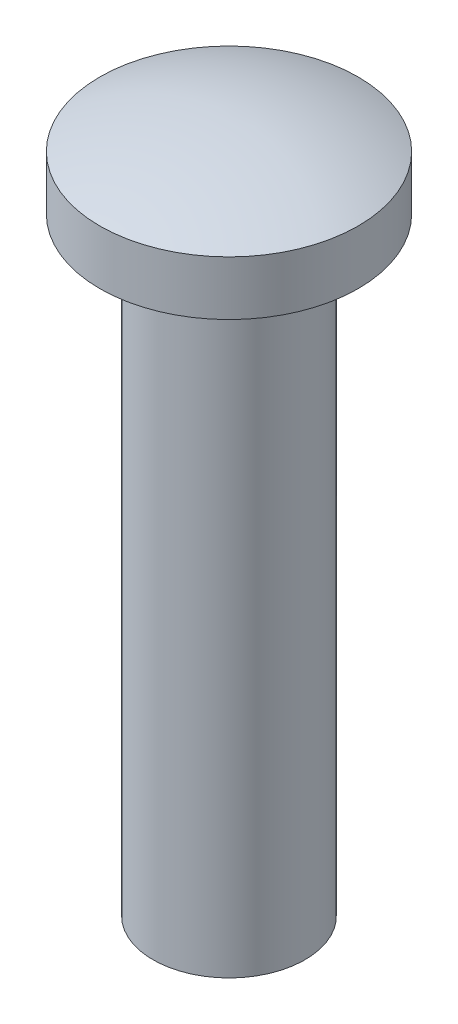
ISO-10303-21;
HEADER;
FILE_DESCRIPTION(('STEP AP214'),'2;1');
FILE_NAME('part.step','',(''),(''),'','','');
FILE_SCHEMA(('AUTOMOTIVE_DESIGN { 1 0 10303 214 1 1 1 1 }'));
ENDSEC;
DATA;
#1=APPLICATION_CONTEXT('core data for automotive mechanical design processes');
#2=APPLICATION_PROTOCOL_DEFINITION('international standard','automotive_design',2000,#1);
#3=PRODUCT_CONTEXT('',#1,'mechanical');
#4=PRODUCT('Part','Part','',(#3));
#5=PRODUCT_RELATED_PRODUCT_CATEGORY('part','',(#4));
#6=PRODUCT_DEFINITION_FORMATION('','',#4);
#7=PRODUCT_DEFINITION_CONTEXT('part definition',#1,'design');
#8=PRODUCT_DEFINITION('design','',#6,#7);
#9=PRODUCT_DEFINITION_SHAPE('','',#8);
#10=(LENGTH_UNIT() NAMED_UNIT(*) SI_UNIT(.MILLI.,.METRE.));
#11=(NAMED_UNIT(*) PLANE_ANGLE_UNIT() SI_UNIT($,.RADIAN.));
#12=(NAMED_UNIT(*) SI_UNIT($,.STERADIAN.) SOLID_ANGLE_UNIT());
#13=UNCERTAINTY_MEASURE_WITH_UNIT(LENGTH_MEASURE(1.E-05),#10,'distance_accuracy_value','');
#14=(GEOMETRIC_REPRESENTATION_CONTEXT(3) GLOBAL_UNCERTAINTY_ASSIGNED_CONTEXT((#13)) GLOBAL_UNIT_ASSIGNED_CONTEXT((#10,
#11,#12)) REPRESENTATION_CONTEXT('',''));
#15=CARTESIAN_POINT('',(0.,0.,0.));
#16=DIRECTION('',(0.,0.,1.));
#17=DIRECTION('',(1.,0.,0.));
#18=AXIS2_PLACEMENT_3D('',#15,#16,#17);
#19=CARTESIAN_POINT('',(-0.5,0.,0.));
#20=DIRECTION('',(0.,1.,0.));
#21=DIRECTION('',(0.,0.,1.));
#22=AXIS2_PLACEMENT_3D('',#19,#20,#21);
#23=PLANE('',#22);
#24=CARTESIAN_POINT('',(0.,0.,0.));
#25=DIRECTION('',(0.,-1.,0.));
#26=DIRECTION('',(0.,0.,-1.));
#27=AXIS2_PLACEMENT_3D('',#24,#25,#26);
#28=CIRCLE('',#27,0.5);
#29=CARTESIAN_POINT('',(0.,0.,-0.5));
#30=VERTEX_POINT('',#29);
#31=EDGE_CURVE('E49',#30,#30,#28,.T.);
#32=ORIENTED_EDGE('',*,*,#31,.T.);
#33=EDGE_LOOP('',(#32));
#34=FACE_BOUND('',#33,.T.);
#35=ADVANCED_FACE('F35',(#34),#23,.F.);
#36=CARTESIAN_POINT('',(0.,2.45205997847441,0.));
#37=DIRECTION('',(0.,-1.,0.));
#38=DIRECTION('',(-1.,0.,0.));
#39=AXIS2_PLACEMENT_3D('',#36,#37,#38);
#40=SPHERICAL_SURFACE('',#39,2.08617938322771);
#41=CARTESIAN_POINT('',(0.,4.35722254870414,0.));
#42=DIRECTION('',(0.,-1.,0.));
#43=DIRECTION('',(0.,0.,-1.));
#44=AXIS2_PLACEMENT_3D('',#41,#42,#43);
#45=CIRCLE('',#44,0.850000000000001);
#46=CARTESIAN_POINT('',(0.,4.35722254870414,-0.850000000000001));
#47=VERTEX_POINT('',#46);
#48=EDGE_CURVE('E10',#47,#47,#45,.T.);
#49=ORIENTED_EDGE('',*,*,#48,.F.);
#50=EDGE_LOOP('',(#49));
#51=FACE_BOUND('',#50,.T.);
#52=ADVANCED_FACE('F69',(#51),#40,.T.);
#53=CARTESIAN_POINT('',(0.,0.,0.));
#54=DIRECTION('',(0.,-1.,0.));
#55=DIRECTION('',(0.,0.,-1.));
#56=AXIS2_PLACEMENT_3D('',#53,#54,#55);
#57=CYLINDRICAL_SURFACE('',#56,0.850000000000001);
#58=CARTESIAN_POINT('',(0.,4.,0.));
#59=DIRECTION('',(0.,-1.,0.));
#60=DIRECTION('',(0.,0.,-1.));
#61=AXIS2_PLACEMENT_3D('',#58,#59,#60);
#62=CIRCLE('',#61,0.850000000000001);
#63=CARTESIAN_POINT('',(0.,4.,-0.850000000000001));
#64=VERTEX_POINT('',#63);
#65=EDGE_CURVE('E41',#64,#64,#62,.T.);
#66=ORIENTED_EDGE('',*,*,#65,.F.);
#67=EDGE_LOOP('',(#66));
#68=FACE_BOUND('',#67,.T.);
#69=ORIENTED_EDGE('',*,*,#48,.T.);
#70=EDGE_LOOP('',(#69));
#71=FACE_BOUND('',#70,.T.);
#72=ADVANCED_FACE('F64',(#68,#71),#57,.T.);
#73=CARTESIAN_POINT('',(-0.850000000000001,4.,0.));
#74=DIRECTION('',(0.,1.,0.));
#75=DIRECTION('',(0.,0.,1.));
#76=AXIS2_PLACEMENT_3D('',#73,#74,#75);
#77=PLANE('',#76);
#78=CARTESIAN_POINT('',(0.,4.,0.));
#79=DIRECTION('',(0.,-1.,0.));
#80=DIRECTION('',(0.,0.,-1.));
#81=AXIS2_PLACEMENT_3D('',#78,#79,#80);
#82=CIRCLE('',#81,0.500000000000001);
#83=CARTESIAN_POINT('',(0.,4.,-0.500000000000001));
#84=VERTEX_POINT('',#83);
#85=EDGE_CURVE('E45',#84,#84,#82,.T.);
#86=ORIENTED_EDGE('',*,*,#85,.F.);
#87=EDGE_LOOP('',(#86));
#88=FACE_BOUND('',#87,.T.);
#89=ORIENTED_EDGE('',*,*,#65,.T.);
#90=EDGE_LOOP('',(#89));
#91=FACE_BOUND('',#90,.T.);
#92=ADVANCED_FACE('F59',(#88,#91),#77,.F.);
#93=CARTESIAN_POINT('',(0.,0.,0.));
#94=DIRECTION('',(0.,-1.,0.));
#95=DIRECTION('',(0.,0.,-1.));
#96=AXIS2_PLACEMENT_3D('',#93,#94,#95);
#97=CYLINDRICAL_SURFACE('',#96,0.5);
#98=ORIENTED_EDGE('',*,*,#31,.F.);
#99=EDGE_LOOP('',(#98));
#100=FACE_BOUND('',#99,.T.);
#101=ORIENTED_EDGE('',*,*,#85,.T.);
#102=EDGE_LOOP('',(#101));
#103=FACE_BOUND('',#102,.T.);
#104=ADVANCED_FACE('F56',(#100,#103),#97,.T.);
#105=CLOSED_SHELL('',(#35,#52,#72,#92,#104));
#106=MANIFOLD_SOLID_BREP('B2',#105);
#107=ADVANCED_BREP_SHAPE_REPRESENTATION('',(#18,#106),#14);
#108=SHAPE_DEFINITION_REPRESENTATION(#9,#107);
ENDSEC;
END-ISO-10303-21;
